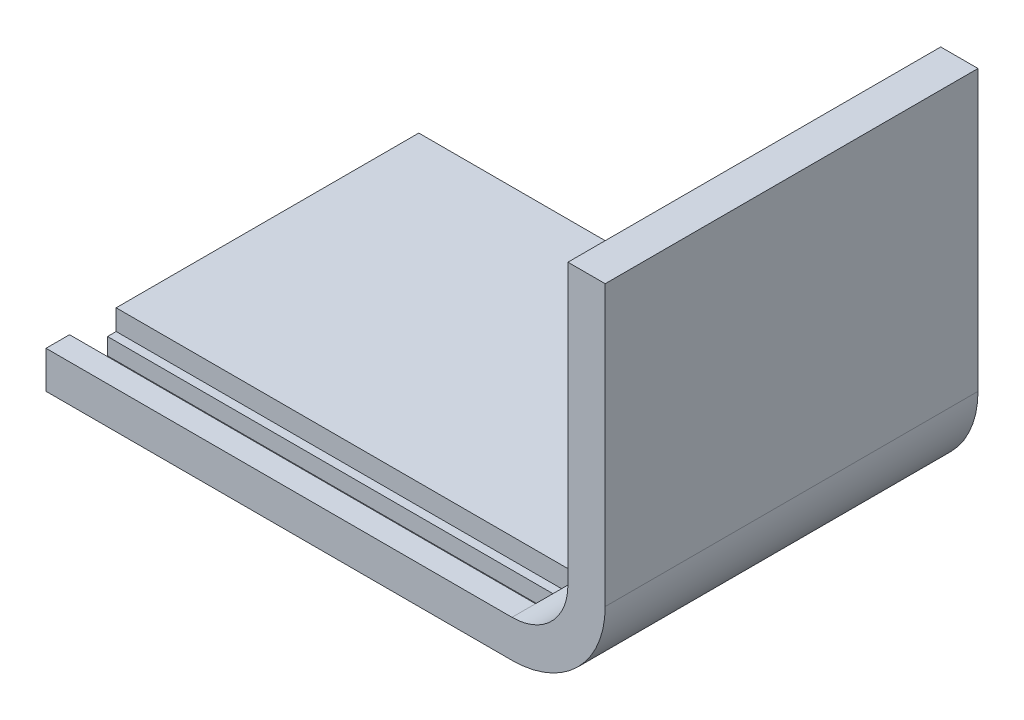
ISO-10303-21;
HEADER;
FILE_DESCRIPTION(('STEP AP214'),'2;1');
FILE_NAME('part.step','',(''),(''),'','','');
FILE_SCHEMA(('AUTOMOTIVE_DESIGN { 1 0 10303 214 1 1 1 1 }'));
ENDSEC;
DATA;
#1=APPLICATION_CONTEXT('core data for automotive mechanical design processes');
#2=APPLICATION_PROTOCOL_DEFINITION('international standard','automotive_design',2000,#1);
#3=PRODUCT_CONTEXT('',#1,'mechanical');
#4=PRODUCT('Part','Part','',(#3));
#5=PRODUCT_RELATED_PRODUCT_CATEGORY('part','',(#4));
#6=PRODUCT_DEFINITION_FORMATION('','',#4);
#7=PRODUCT_DEFINITION_CONTEXT('part definition',#1,'design');
#8=PRODUCT_DEFINITION('design','',#6,#7);
#9=PRODUCT_DEFINITION_SHAPE('','',#8);
#10=(LENGTH_UNIT() NAMED_UNIT(*) SI_UNIT(.MILLI.,.METRE.));
#11=(NAMED_UNIT(*) PLANE_ANGLE_UNIT() SI_UNIT($,.RADIAN.));
#12=(NAMED_UNIT(*) SI_UNIT($,.STERADIAN.) SOLID_ANGLE_UNIT());
#13=UNCERTAINTY_MEASURE_WITH_UNIT(LENGTH_MEASURE(1.E-05),#10,'distance_accuracy_value','');
#14=(GEOMETRIC_REPRESENTATION_CONTEXT(3) GLOBAL_UNCERTAINTY_ASSIGNED_CONTEXT((#13)) GLOBAL_UNIT_ASSIGNED_CONTEXT((#10,
#11,#12)) REPRESENTATION_CONTEXT('',''));
#15=CARTESIAN_POINT('',(0.,0.,0.));
#16=DIRECTION('',(0.,0.,1.));
#17=DIRECTION('',(1.,0.,0.));
#18=AXIS2_PLACEMENT_3D('',#15,#16,#17);
#19=CARTESIAN_POINT('',(0.,0.,0.));
#20=DIRECTION('',(1.,0.,0.));
#21=DIRECTION('',(0.,0.,-1.));
#22=AXIS2_PLACEMENT_3D('',#19,#20,#21);
#23=PLANE('',#22);
#24=DIRECTION('',(0.,0.,-1.));
#25=VECTOR('',#24,1.);
#26=CARTESIAN_POINT('',(0.,-114.3,-127.));
#27=LINE('',#26,#25);
#28=CARTESIAN_POINT('',(0.,-114.3,0.));
#29=VERTEX_POINT('',#28);
#30=CARTESIAN_POINT('',(0.,-114.3,-8.01750000000001));
#31=VERTEX_POINT('',#30);
#32=EDGE_CURVE('E43',#29,#31,#27,.T.);
#33=ORIENTED_EDGE('',*,*,#32,.T.);
#34=DIRECTION('',(0.,1.,0.));
#35=VECTOR('',#34,1.);
#36=CARTESIAN_POINT('',(0.,-121.3,-8.01750000000001));
#37=LINE('',#36,#35);
#38=CARTESIAN_POINT('',(0.,-121.3,-8.01750000000001));
#39=VERTEX_POINT('',#38);
#40=EDGE_CURVE('E312',#39,#31,#37,.T.);
#41=ORIENTED_EDGE('',*,*,#40,.F.);
#42=DIRECTION('',(0.,0.,1.));
#43=VECTOR('',#42,1.);
#44=CARTESIAN_POINT('',(0.,-121.3,0.));
#45=LINE('',#44,#43);
#46=CARTESIAN_POINT('',(0.,-121.3,-10.455));
#47=VERTEX_POINT('',#46);
#48=EDGE_CURVE('E316',#47,#39,#45,.T.);
#49=ORIENTED_EDGE('',*,*,#48,.F.);
#50=DIRECTION('',(0.,1.,0.));
#51=VECTOR('',#50,1.);
#52=CARTESIAN_POINT('',(0.,127.001,-10.455));
#53=LINE('',#52,#51);
#54=CARTESIAN_POINT('',(0.,-127.,-10.455));
#55=VERTEX_POINT('',#54);
#56=EDGE_CURVE('E314',#55,#47,#53,.T.);
#57=ORIENTED_EDGE('',*,*,#56,.F.);
#58=DIRECTION('',(0.,0.,1.));
#59=VECTOR('',#58,1.);
#60=CARTESIAN_POINT('',(0.,-127.,-127.));
#61=LINE('',#60,#59);
#62=CARTESIAN_POINT('',(0.,-127.,0.));
#63=VERTEX_POINT('',#62);
#64=EDGE_CURVE('E166',#55,#63,#61,.T.);
#65=ORIENTED_EDGE('',*,*,#64,.T.);
#66=DIRECTION('',(0.,-1.,0.));
#67=VECTOR('',#66,1.);
#68=CARTESIAN_POINT('',(0.,0.,0.));
#69=LINE('',#68,#67);
#70=EDGE_CURVE('E161',#29,#63,#69,.T.);
#71=ORIENTED_EDGE('',*,*,#70,.F.);
#72=EDGE_LOOP('',(#33,#41,#49,#57,#65,#71));
#73=FACE_BOUND('',#72,.T.);
#74=ADVANCED_FACE('F39',(#73),#23,.F.);
#75=DIRECTION('',(0.,-1.,0.));
#76=VECTOR('',#75,1.);
#77=CARTESIAN_POINT('',(0.,0.,-127.));
#78=LINE('',#77,#76);
#79=CARTESIAN_POINT('',(0.,-114.3,-127.));
#80=VERTEX_POINT('',#79);
#81=CARTESIAN_POINT('',(0.,-127.,-127.));
#82=VERTEX_POINT('',#81);
#83=EDGE_CURVE('E232',#80,#82,#78,.T.);
#84=ORIENTED_EDGE('',*,*,#83,.T.);
#85=DIRECTION('',(0.,0.,1.));
#86=VECTOR('',#85,1.);
#87=CARTESIAN_POINT('',(0.,-127.,-127.));
#88=LINE('',#87,#86);
#89=CARTESIAN_POINT('',(0.,-127.,-20.955));
#90=VERTEX_POINT('',#89);
#91=EDGE_CURVE('E235',#82,#90,#88,.T.);
#92=ORIENTED_EDGE('',*,*,#91,.T.);
#93=DIRECTION('',(0.,-1.,0.));
#94=VECTOR('',#93,1.);
#95=CARTESIAN_POINT('',(0.,127.001,-20.955));
#96=LINE('',#95,#94);
#97=CARTESIAN_POINT('',(0.,-121.3,-20.955));
#98=VERTEX_POINT('',#97);
#99=EDGE_CURVE('E239',#98,#90,#96,.T.);
#100=ORIENTED_EDGE('',*,*,#99,.F.);
#101=DIRECTION('',(0.,0.,1.));
#102=VECTOR('',#101,1.);
#103=CARTESIAN_POINT('',(0.,-121.3,0.));
#104=LINE('',#103,#102);
#105=CARTESIAN_POINT('',(0.,-121.3,-23.8925));
#106=VERTEX_POINT('',#105);
#107=EDGE_CURVE('E311',#106,#98,#104,.T.);
#108=ORIENTED_EDGE('',*,*,#107,.F.);
#109=DIRECTION('',(0.,-1.,0.));
#110=VECTOR('',#109,1.);
#111=CARTESIAN_POINT('',(0.,-121.3,-23.8925));
#112=LINE('',#111,#110);
#113=CARTESIAN_POINT('',(0.,-114.3,-23.8925));
#114=VERTEX_POINT('',#113);
#115=EDGE_CURVE('E249',#114,#106,#112,.T.);
#116=ORIENTED_EDGE('',*,*,#115,.F.);
#117=DIRECTION('',(0.,0.,-1.));
#118=VECTOR('',#117,1.);
#119=CARTESIAN_POINT('',(0.,-114.3,-127.));
#120=LINE('',#119,#118);
#121=EDGE_CURVE('E252',#114,#80,#120,.T.);
#122=ORIENTED_EDGE('',*,*,#121,.T.);
#123=EDGE_LOOP('',(#84,#92,#100,#108,#116,#122));
#124=FACE_BOUND('',#123,.T.);
#125=ADVANCED_FACE('F258',(#124),#23,.F.);
#126=CARTESIAN_POINT('',(0.,0.,0.));
#127=DIRECTION('',(0.,1.,0.));
#128=DIRECTION('',(0.,0.,1.));
#129=AXIS2_PLACEMENT_3D('',#126,#127,#128);
#130=PLANE('',#129);
#131=DIRECTION('',(0.,0.,1.));
#132=VECTOR('',#131,1.);
#133=CARTESIAN_POINT('',(190.5,0.,-127.));
#134=LINE('',#133,#132);
#135=CARTESIAN_POINT('',(190.5,0.,-127.));
#136=VERTEX_POINT('',#135);
#137=CARTESIAN_POINT('',(190.5,0.,0.));
#138=VERTEX_POINT('',#137);
#139=EDGE_CURVE('E170',#136,#138,#134,.T.);
#140=ORIENTED_EDGE('',*,*,#139,.F.);
#141=DIRECTION('',(1.,0.,0.));
#142=VECTOR('',#141,1.);
#143=CARTESIAN_POINT('',(0.,0.,-127.));
#144=LINE('',#143,#142);
#145=CARTESIAN_POINT('',(177.8,0.,-127.));
#146=VERTEX_POINT('',#145);
#147=EDGE_CURVE('E171',#146,#136,#144,.T.);
#148=ORIENTED_EDGE('',*,*,#147,.F.);
#149=DIRECTION('',(0.,0.,-1.));
#150=VECTOR('',#149,1.);
#151=CARTESIAN_POINT('',(177.8,0.,-127.));
#152=LINE('',#151,#150);
#153=CARTESIAN_POINT('',(177.8,0.,0.));
#154=VERTEX_POINT('',#153);
#155=EDGE_CURVE('E237',#154,#146,#152,.T.);
#156=ORIENTED_EDGE('',*,*,#155,.F.);
#157=DIRECTION('',(1.,0.,0.));
#158=VECTOR('',#157,1.);
#159=CARTESIAN_POINT('',(0.,0.,0.));
#160=LINE('',#159,#158);
#161=EDGE_CURVE('E229',#154,#138,#160,.T.);
#162=ORIENTED_EDGE('',*,*,#161,.T.);
#163=EDGE_LOOP('',(#140,#148,#156,#162));
#164=FACE_BOUND('',#163,.T.);
#165=ADVANCED_FACE('F328',(#164),#130,.T.);
#166=CARTESIAN_POINT('',(158.75,-95.25,-127.));
#167=DIRECTION('',(0.,0.,1.));
#168=DIRECTION('',(1.,0.,0.));
#169=AXIS2_PLACEMENT_3D('',#166,#167,#168);
#170=CYLINDRICAL_SURFACE('',#169,31.75);
#171=CARTESIAN_POINT('',(158.75,-95.25,-127.));
#172=DIRECTION('',(0.,0.,-1.));
#173=DIRECTION('',(-1.,0.,0.));
#174=AXIS2_PLACEMENT_3D('',#171,#172,#173);
#175=CIRCLE('',#174,31.75);
#176=CARTESIAN_POINT('',(190.5,-95.25,-127.));
#177=VERTEX_POINT('',#176);
#178=CARTESIAN_POINT('',(158.75,-127.,-127.));
#179=VERTEX_POINT('',#178);
#180=EDGE_CURVE('E248',#177,#179,#175,.T.);
#181=ORIENTED_EDGE('',*,*,#180,.F.);
#182=DIRECTION('',(0.,0.,1.));
#183=VECTOR('',#182,1.);
#184=CARTESIAN_POINT('',(190.5,-95.25,-127.));
#185=LINE('',#184,#183);
#186=CARTESIAN_POINT('',(190.5,-95.25,0.));
#187=VERTEX_POINT('',#186);
#188=EDGE_CURVE('E322',#187,#177,#185,.F.);
#189=ORIENTED_EDGE('',*,*,#188,.F.);
#190=CARTESIAN_POINT('',(158.75,-95.25,0.));
#191=DIRECTION('',(0.,0.,-1.));
#192=DIRECTION('',(-1.,0.,0.));
#193=AXIS2_PLACEMENT_3D('',#190,#191,#192);
#194=CIRCLE('',#193,31.75);
#195=CARTESIAN_POINT('',(158.75,-127.,0.));
#196=VERTEX_POINT('',#195);
#197=EDGE_CURVE('E287',#196,#187,#194,.F.);
#198=ORIENTED_EDGE('',*,*,#197,.F.);
#199=DIRECTION('',(0.,0.,1.));
#200=VECTOR('',#199,1.);
#201=CARTESIAN_POINT('',(158.75,-127.,-127.));
#202=LINE('',#201,#200);
#203=CARTESIAN_POINT('',(158.75,-127.,-10.455));
#204=VERTEX_POINT('',#203);
#205=EDGE_CURVE('E245',#204,#196,#202,.T.);
#206=ORIENTED_EDGE('',*,*,#205,.F.);
#207=DIRECTION('',(0.,0.,1.));
#208=VECTOR('',#207,1.);
#209=CARTESIAN_POINT('',(158.75,-127.,-10.455));
#210=LINE('',#209,#208);
#211=CARTESIAN_POINT('',(158.75,-127.,-20.955));
#212=VERTEX_POINT('',#211);
#213=EDGE_CURVE('E202',#212,#204,#210,.T.);
#214=ORIENTED_EDGE('',*,*,#213,.F.);
#215=EDGE_CURVE('E273',#179,#212,#202,.T.);
#216=ORIENTED_EDGE('',*,*,#215,.F.);
#217=EDGE_LOOP('',(#181,#189,#198,#206,#214,#216));
#218=FACE_BOUND('',#217,.T.);
#219=ADVANCED_FACE('F283',(#218),#170,.T.);
#220=CARTESIAN_POINT('',(158.75,-95.25,-127.));
#221=DIRECTION('',(0.,0.,1.));
#222=DIRECTION('',(1.,0.,0.));
#223=AXIS2_PLACEMENT_3D('',#220,#221,#222);
#224=CYLINDRICAL_SURFACE('',#223,19.05);
#225=CARTESIAN_POINT('',(158.75,-95.25,0.));
#226=DIRECTION('',(0.,0.,-1.));
#227=DIRECTION('',(-1.,0.,0.));
#228=AXIS2_PLACEMENT_3D('',#225,#226,#227);
#229=CIRCLE('',#228,19.05);
#230=CARTESIAN_POINT('',(177.8,-95.25,0.));
#231=VERTEX_POINT('',#230);
#232=CARTESIAN_POINT('',(158.75,-114.3,0.));
#233=VERTEX_POINT('',#232);
#234=EDGE_CURVE('E181',#231,#233,#229,.T.);
#235=ORIENTED_EDGE('',*,*,#234,.F.);
#236=DIRECTION('',(0.,0.,1.));
#237=VECTOR('',#236,1.);
#238=CARTESIAN_POINT('',(177.8,-95.25,-127.));
#239=LINE('',#238,#237);
#240=CARTESIAN_POINT('',(177.8,-95.25,-127.));
#241=VERTEX_POINT('',#240);
#242=EDGE_CURVE('E189',#241,#231,#239,.T.);
#243=ORIENTED_EDGE('',*,*,#242,.F.);
#244=CARTESIAN_POINT('',(158.75,-95.25,-127.));
#245=DIRECTION('',(0.,0.,-1.));
#246=DIRECTION('',(-1.,0.,0.));
#247=AXIS2_PLACEMENT_3D('',#244,#245,#246);
#248=CIRCLE('',#247,19.05);
#249=CARTESIAN_POINT('',(158.75,-114.3,-127.));
#250=VERTEX_POINT('',#249);
#251=EDGE_CURVE('E186',#241,#250,#248,.T.);
#252=ORIENTED_EDGE('',*,*,#251,.T.);
#253=DIRECTION('',(0.,0.,1.));
#254=VECTOR('',#253,1.);
#255=CARTESIAN_POINT('',(158.75,-114.3,-127.));
#256=LINE('',#255,#254);
#257=CARTESIAN_POINT('',(158.75,-114.3,-23.8925));
#258=VERTEX_POINT('',#257);
#259=EDGE_CURVE('E223',#250,#258,#256,.T.);
#260=ORIENTED_EDGE('',*,*,#259,.T.);
#261=CARTESIAN_POINT('',(158.75,-114.3,-8.01750000000001));
#262=VERTEX_POINT('',#261);
#263=EDGE_CURVE('E58',#258,#262,#256,.T.);
#264=ORIENTED_EDGE('',*,*,#263,.T.);
#265=EDGE_CURVE('E293',#262,#233,#256,.T.);
#266=ORIENTED_EDGE('',*,*,#265,.T.);
#267=EDGE_LOOP('',(#235,#243,#252,#260,#264,#266));
#268=FACE_BOUND('',#267,.T.);
#269=ADVANCED_FACE('F302',(#268),#224,.F.);
#270=CARTESIAN_POINT('',(0.,0.,-127.));
#271=DIRECTION('',(0.,0.,-1.));
#272=DIRECTION('',(-1.,0.,0.));
#273=AXIS2_PLACEMENT_3D('',#270,#271,#272);
#274=PLANE('',#273);
#275=DIRECTION('',(0.,-1.,0.));
#276=VECTOR('',#275,1.);
#277=CARTESIAN_POINT('',(177.8,107.95,-127.));
#278=LINE('',#277,#276);
#279=EDGE_CURVE('E195',#146,#241,#278,.T.);
#280=ORIENTED_EDGE('',*,*,#279,.F.);
#281=ORIENTED_EDGE('',*,*,#147,.T.);
#282=DIRECTION('',(0.,1.,0.));
#283=VECTOR('',#282,1.);
#284=CARTESIAN_POINT('',(190.5,-127.,-127.));
#285=LINE('',#284,#283);
#286=EDGE_CURVE('E225',#177,#136,#285,.T.);
#287=ORIENTED_EDGE('',*,*,#286,.F.);
#288=ORIENTED_EDGE('',*,*,#180,.T.);
#289=DIRECTION('',(1.,0.,0.));
#290=VECTOR('',#289,1.);
#291=CARTESIAN_POINT('',(-190.5,-127.,-127.));
#292=LINE('',#291,#290);
#293=EDGE_CURVE('E228',#82,#179,#292,.T.);
#294=ORIENTED_EDGE('',*,*,#293,.F.);
#295=ORIENTED_EDGE('',*,*,#83,.F.);
#296=DIRECTION('',(-1.,0.,0.));
#297=VECTOR('',#296,1.);
#298=CARTESIAN_POINT('',(158.75,-114.3,-127.));
#299=LINE('',#298,#297);
#300=EDGE_CURVE('E192',#250,#80,#299,.T.);
#301=ORIENTED_EDGE('',*,*,#300,.F.);
#302=ORIENTED_EDGE('',*,*,#251,.F.);
#303=EDGE_LOOP('',(#280,#281,#287,#288,#294,#295,#301,#302));
#304=FACE_BOUND('',#303,.T.);
#305=ADVANCED_FACE('F266',(#304),#274,.T.);
#306=CARTESIAN_POINT('',(0.,0.,0.));
#307=DIRECTION('',(0.,0.,-1.));
#308=DIRECTION('',(-1.,0.,0.));
#309=AXIS2_PLACEMENT_3D('',#306,#307,#308);
#310=PLANE('',#309);
#311=ORIENTED_EDGE('',*,*,#161,.F.);
#312=DIRECTION('',(0.,-1.,0.));
#313=VECTOR('',#312,1.);
#314=CARTESIAN_POINT('',(177.8,107.95,0.));
#315=LINE('',#314,#313);
#316=EDGE_CURVE('E182',#154,#231,#315,.T.);
#317=ORIENTED_EDGE('',*,*,#316,.T.);
#318=ORIENTED_EDGE('',*,*,#234,.T.);
#319=DIRECTION('',(-1.,0.,0.));
#320=VECTOR('',#319,1.);
#321=CARTESIAN_POINT('',(158.75,-114.3,0.));
#322=LINE('',#321,#320);
#323=EDGE_CURVE('E177',#233,#29,#322,.T.);
#324=ORIENTED_EDGE('',*,*,#323,.T.);
#325=ORIENTED_EDGE('',*,*,#70,.T.);
#326=DIRECTION('',(1.,0.,0.));
#327=VECTOR('',#326,1.);
#328=CARTESIAN_POINT('',(-190.5,-127.,0.));
#329=LINE('',#328,#327);
#330=EDGE_CURVE('E224',#63,#196,#329,.T.);
#331=ORIENTED_EDGE('',*,*,#330,.T.);
#332=ORIENTED_EDGE('',*,*,#197,.T.);
#333=DIRECTION('',(0.,1.,0.));
#334=VECTOR('',#333,1.);
#335=CARTESIAN_POINT('',(190.5,-127.,0.));
#336=LINE('',#335,#334);
#337=EDGE_CURVE('E220',#187,#138,#336,.T.);
#338=ORIENTED_EDGE('',*,*,#337,.T.);
#339=EDGE_LOOP('',(#311,#317,#318,#324,#325,#331,#332,#338));
#340=FACE_BOUND('',#339,.T.);
#341=ADVANCED_FACE('F41',(#340),#310,.F.);
#342=CARTESIAN_POINT('',(177.8,107.95,-127.));
#343=DIRECTION('',(-1.,0.,0.));
#344=DIRECTION('',(0.,0.,1.));
#345=AXIS2_PLACEMENT_3D('',#342,#343,#344);
#346=PLANE('',#345);
#347=ORIENTED_EDGE('',*,*,#316,.F.);
#348=ORIENTED_EDGE('',*,*,#155,.T.);
#349=ORIENTED_EDGE('',*,*,#279,.T.);
#350=ORIENTED_EDGE('',*,*,#242,.T.);
#351=EDGE_LOOP('',(#347,#348,#349,#350));
#352=FACE_BOUND('',#351,.T.);
#353=ADVANCED_FACE('F300',(#352),#346,.T.);
#354=CARTESIAN_POINT('',(-190.5,-127.,-127.));
#355=DIRECTION('',(0.,-1.,0.));
#356=DIRECTION('',(0.,0.,-1.));
#357=AXIS2_PLACEMENT_3D('',#354,#355,#356);
#358=PLANE('',#357);
#359=ORIENTED_EDGE('',*,*,#91,.F.);
#360=ORIENTED_EDGE('',*,*,#293,.T.);
#361=ORIENTED_EDGE('',*,*,#215,.T.);
#362=DIRECTION('',(1.,0.,0.));
#363=VECTOR('',#362,1.);
#364=CARTESIAN_POINT('',(158.75,-127.,-20.955));
#365=LINE('',#364,#363);
#366=EDGE_CURVE('E184',#90,#212,#365,.T.);
#367=ORIENTED_EDGE('',*,*,#366,.F.);
#368=EDGE_LOOP('',(#359,#360,#361,#367));
#369=FACE_BOUND('',#368,.T.);
#370=ADVANCED_FACE('F272',(#369),#358,.T.);
#371=ORIENTED_EDGE('',*,*,#64,.F.);
#372=DIRECTION('',(-1.,0.,0.));
#373=VECTOR('',#372,1.);
#374=CARTESIAN_POINT('',(158.75,-127.,-10.455));
#375=LINE('',#374,#373);
#376=EDGE_CURVE('E205',#204,#55,#375,.T.);
#377=ORIENTED_EDGE('',*,*,#376,.F.);
#378=ORIENTED_EDGE('',*,*,#205,.T.);
#379=ORIENTED_EDGE('',*,*,#330,.F.);
#380=EDGE_LOOP('',(#371,#377,#378,#379));
#381=FACE_BOUND('',#380,.T.);
#382=ADVANCED_FACE('F351',(#381),#358,.T.);
#383=CARTESIAN_POINT('',(158.75,127.001,-10.455));
#384=DIRECTION('',(0.,0.,1.));
#385=DIRECTION('',(1.,0.,0.));
#386=AXIS2_PLACEMENT_3D('',#383,#384,#385);
#387=PLANE('',#386);
#388=ORIENTED_EDGE('',*,*,#376,.T.);
#389=ORIENTED_EDGE('',*,*,#56,.T.);
#390=DIRECTION('',(1.,0.,0.));
#391=VECTOR('',#390,1.);
#392=CARTESIAN_POINT('',(158.75,-121.3,-10.455));
#393=LINE('',#392,#391);
#394=CARTESIAN_POINT('',(158.75,-121.3,-10.455));
#395=VERTEX_POINT('',#394);
#396=EDGE_CURVE('E246',#47,#395,#393,.T.);
#397=ORIENTED_EDGE('',*,*,#396,.T.);
#398=DIRECTION('',(0.,-1.,0.));
#399=VECTOR('',#398,1.);
#400=CARTESIAN_POINT('',(158.75,127.001,-10.455));
#401=LINE('',#400,#399);
#402=EDGE_CURVE('E197',#395,#204,#401,.T.);
#403=ORIENTED_EDGE('',*,*,#402,.T.);
#404=EDGE_LOOP('',(#388,#389,#397,#403));
#405=FACE_BOUND('',#404,.T.);
#406=ADVANCED_FACE('F370',(#405),#387,.F.);
#407=CARTESIAN_POINT('',(158.75,127.001,-20.955));
#408=DIRECTION('',(0.,0.,-1.));
#409=DIRECTION('',(-1.,0.,0.));
#410=AXIS2_PLACEMENT_3D('',#407,#408,#409);
#411=PLANE('',#410);
#412=DIRECTION('',(-1.,0.,0.));
#413=VECTOR('',#412,1.);
#414=CARTESIAN_POINT('',(158.75,-121.3,-20.955));
#415=LINE('',#414,#413);
#416=CARTESIAN_POINT('',(158.75,-121.3,-20.955));
#417=VERTEX_POINT('',#416);
#418=EDGE_CURVE('E78',#417,#98,#415,.T.);
#419=ORIENTED_EDGE('',*,*,#418,.T.);
#420=ORIENTED_EDGE('',*,*,#99,.T.);
#421=ORIENTED_EDGE('',*,*,#366,.T.);
#422=DIRECTION('',(0.,-1.,0.));
#423=VECTOR('',#422,1.);
#424=CARTESIAN_POINT('',(158.75,127.001,-20.955));
#425=LINE('',#424,#423);
#426=EDGE_CURVE('E199',#417,#212,#425,.T.);
#427=ORIENTED_EDGE('',*,*,#426,.F.);
#428=EDGE_LOOP('',(#419,#420,#421,#427));
#429=FACE_BOUND('',#428,.T.);
#430=ADVANCED_FACE('F276',(#429),#411,.F.);
#431=CARTESIAN_POINT('',(158.75,127.001,-10.455));
#432=DIRECTION('',(1.,0.,0.));
#433=DIRECTION('',(0.,0.,-1.));
#434=AXIS2_PLACEMENT_3D('',#431,#432,#433);
#435=PLANE('',#434);
#436=ORIENTED_EDGE('',*,*,#402,.F.);
#437=DIRECTION('',(0.,0.,-1.));
#438=VECTOR('',#437,1.);
#439=CARTESIAN_POINT('',(158.75,-121.3,-8.01750000000001));
#440=LINE('',#439,#438);
#441=CARTESIAN_POINT('',(158.75,-121.3,-8.01750000000001));
#442=VERTEX_POINT('',#441);
#443=EDGE_CURVE('E216',#442,#395,#440,.T.);
#444=ORIENTED_EDGE('',*,*,#443,.F.);
#445=DIRECTION('',(0.,1.,0.));
#446=VECTOR('',#445,1.);
#447=CARTESIAN_POINT('',(158.75,-121.3,-8.01750000000001));
#448=LINE('',#447,#446);
#449=EDGE_CURVE('E209',#442,#262,#448,.T.);
#450=ORIENTED_EDGE('',*,*,#449,.T.);
#451=ORIENTED_EDGE('',*,*,#263,.F.);
#452=DIRECTION('',(0.,1.,0.));
#453=VECTOR('',#452,1.);
#454=CARTESIAN_POINT('',(158.75,-121.3,-23.8925));
#455=LINE('',#454,#453);
#456=CARTESIAN_POINT('',(158.75,-121.3,-23.8925));
#457=VERTEX_POINT('',#456);
#458=EDGE_CURVE('E210',#457,#258,#455,.T.);
#459=ORIENTED_EDGE('',*,*,#458,.F.);
#460=EDGE_CURVE('E217',#417,#457,#440,.T.);
#461=ORIENTED_EDGE('',*,*,#460,.F.);
#462=ORIENTED_EDGE('',*,*,#426,.T.);
#463=ORIENTED_EDGE('',*,*,#213,.T.);
#464=EDGE_LOOP('',(#436,#444,#450,#451,#459,#461,#462,#463));
#465=FACE_BOUND('',#464,.T.);
#466=ADVANCED_FACE('F279',(#465),#435,.F.);
#467=CARTESIAN_POINT('',(0.,-121.3,0.));
#468=DIRECTION('',(0.,-1.,0.));
#469=DIRECTION('',(0.,0.,-1.));
#470=AXIS2_PLACEMENT_3D('',#467,#468,#469);
#471=PLANE('',#470);
#472=DIRECTION('',(-1.,0.,0.));
#473=VECTOR('',#472,1.);
#474=CARTESIAN_POINT('',(-171.45,-121.3,-23.8925));
#475=LINE('',#474,#473);
#476=EDGE_CURVE('E213',#457,#106,#475,.T.);
#477=ORIENTED_EDGE('',*,*,#476,.T.);
#478=ORIENTED_EDGE('',*,*,#107,.T.);
#479=ORIENTED_EDGE('',*,*,#418,.F.);
#480=ORIENTED_EDGE('',*,*,#460,.T.);
#481=EDGE_LOOP('',(#477,#478,#479,#480));
#482=FACE_BOUND('',#481,.T.);
#483=ADVANCED_FACE('F310',(#482),#471,.F.);
#484=CARTESIAN_POINT('',(158.75,-114.3,-127.));
#485=DIRECTION('',(0.,1.,0.));
#486=DIRECTION('',(0.,0.,1.));
#487=AXIS2_PLACEMENT_3D('',#484,#485,#486);
#488=PLANE('',#487);
#489=ORIENTED_EDGE('',*,*,#121,.F.);
#490=DIRECTION('',(-1.,0.,0.));
#491=VECTOR('',#490,1.);
#492=CARTESIAN_POINT('',(-171.45,-114.3,-23.8925));
#493=LINE('',#492,#491);
#494=EDGE_CURVE('E11',#258,#114,#493,.T.);
#495=ORIENTED_EDGE('',*,*,#494,.F.);
#496=ORIENTED_EDGE('',*,*,#259,.F.);
#497=ORIENTED_EDGE('',*,*,#300,.T.);
#498=EDGE_LOOP('',(#489,#495,#496,#497));
#499=FACE_BOUND('',#498,.T.);
#500=ADVANCED_FACE('F304',(#499),#488,.T.);
#501=CARTESIAN_POINT('',(-171.45,-121.3,-23.8925));
#502=DIRECTION('',(0.,0.,-1.));
#503=DIRECTION('',(-1.,0.,0.));
#504=AXIS2_PLACEMENT_3D('',#501,#502,#503);
#505=PLANE('',#504);
#506=ORIENTED_EDGE('',*,*,#494,.T.);
#507=ORIENTED_EDGE('',*,*,#115,.T.);
#508=ORIENTED_EDGE('',*,*,#476,.F.);
#509=ORIENTED_EDGE('',*,*,#458,.T.);
#510=EDGE_LOOP('',(#506,#507,#508,#509));
#511=FACE_BOUND('',#510,.T.);
#512=ADVANCED_FACE('F307',(#511),#505,.F.);
#513=ORIENTED_EDGE('',*,*,#32,.F.);
#514=ORIENTED_EDGE('',*,*,#323,.F.);
#515=ORIENTED_EDGE('',*,*,#265,.F.);
#516=DIRECTION('',(1.,0.,0.));
#517=VECTOR('',#516,1.);
#518=CARTESIAN_POINT('',(-171.45,-114.3,-8.01750000000001));
#519=LINE('',#518,#517);
#520=EDGE_CURVE('E49',#31,#262,#519,.T.);
#521=ORIENTED_EDGE('',*,*,#520,.F.);
#522=EDGE_LOOP('',(#513,#514,#515,#521));
#523=FACE_BOUND('',#522,.T.);
#524=ADVANCED_FACE('F175',(#523),#488,.T.);
#525=ORIENTED_EDGE('',*,*,#396,.F.);
#526=ORIENTED_EDGE('',*,*,#48,.T.);
#527=DIRECTION('',(1.,0.,0.));
#528=VECTOR('',#527,1.);
#529=CARTESIAN_POINT('',(-171.45,-121.3,-8.01750000000001));
#530=LINE('',#529,#528);
#531=EDGE_CURVE('E70',#39,#442,#530,.T.);
#532=ORIENTED_EDGE('',*,*,#531,.T.);
#533=ORIENTED_EDGE('',*,*,#443,.T.);
#534=EDGE_LOOP('',(#525,#526,#532,#533));
#535=FACE_BOUND('',#534,.T.);
#536=ADVANCED_FACE('F365',(#535),#471,.F.);
#537=CARTESIAN_POINT('',(-171.45,-121.3,-8.01750000000001));
#538=DIRECTION('',(0.,0.,1.));
#539=DIRECTION('',(1.,0.,0.));
#540=AXIS2_PLACEMENT_3D('',#537,#538,#539);
#541=PLANE('',#540);
#542=ORIENTED_EDGE('',*,*,#531,.F.);
#543=ORIENTED_EDGE('',*,*,#40,.T.);
#544=ORIENTED_EDGE('',*,*,#520,.T.);
#545=ORIENTED_EDGE('',*,*,#449,.F.);
#546=EDGE_LOOP('',(#542,#543,#544,#545));
#547=FACE_BOUND('',#546,.T.);
#548=ADVANCED_FACE('F339',(#547),#541,.F.);
#549=CARTESIAN_POINT('',(190.5,-127.,-127.));
#550=DIRECTION('',(1.,0.,0.));
#551=DIRECTION('',(0.,0.,-1.));
#552=AXIS2_PLACEMENT_3D('',#549,#550,#551);
#553=PLANE('',#552);
#554=ORIENTED_EDGE('',*,*,#286,.T.);
#555=ORIENTED_EDGE('',*,*,#139,.T.);
#556=ORIENTED_EDGE('',*,*,#337,.F.);
#557=ORIENTED_EDGE('',*,*,#188,.T.);
#558=EDGE_LOOP('',(#554,#555,#556,#557));
#559=FACE_BOUND('',#558,.T.);
#560=ADVANCED_FACE('F325',(#559),#553,.T.);
#561=CLOSED_SHELL('',(#74,#125,#165,#219,#269,#305,#341,#353,#370,#382,#406,#430,#466,#483,#500,
#512,#524,#536,#548,#560));
#562=MANIFOLD_SOLID_BREP('B2',#561);
#563=ADVANCED_BREP_SHAPE_REPRESENTATION('',(#18,#562),#14);
#564=SHAPE_DEFINITION_REPRESENTATION(#9,#563);
ENDSEC;
END-ISO-10303-21;
